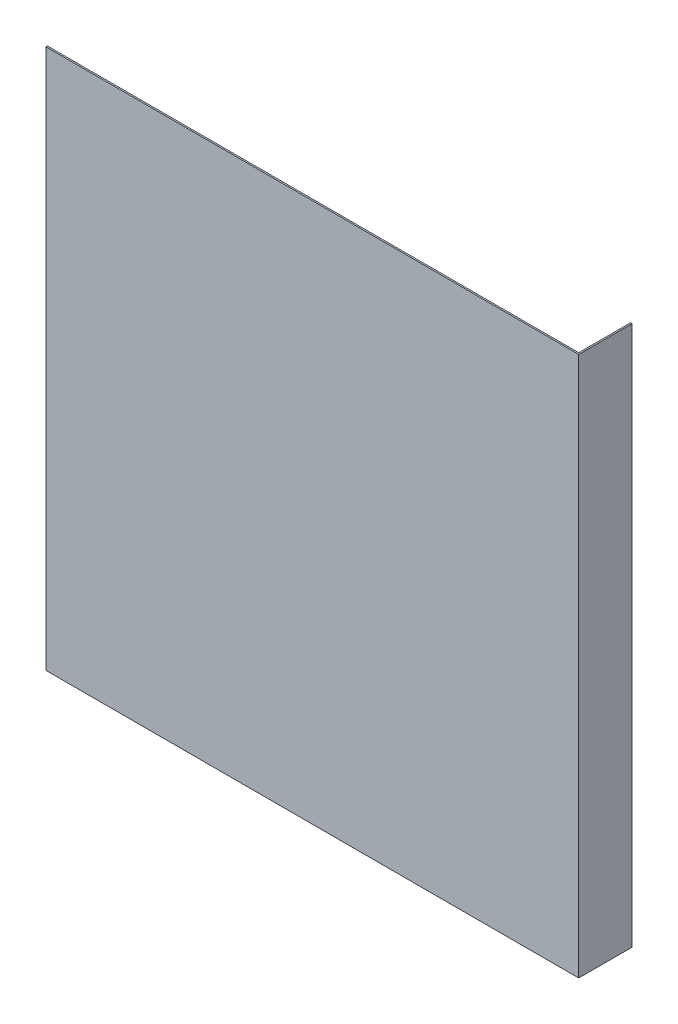
ISO-10303-21;
HEADER;
FILE_DESCRIPTION(('STEP AP214'),'2;1');
FILE_NAME('part.step','',(''),(''),'','','');
FILE_SCHEMA(('AUTOMOTIVE_DESIGN { 1 0 10303 214 1 1 1 1 }'));
ENDSEC;
DATA;
#1=APPLICATION_CONTEXT('core data for automotive mechanical design processes');
#2=APPLICATION_PROTOCOL_DEFINITION('international standard','automotive_design',2000,#1);
#3=PRODUCT_CONTEXT('',#1,'mechanical');
#4=PRODUCT('Part','Part','',(#3));
#5=PRODUCT_RELATED_PRODUCT_CATEGORY('part','',(#4));
#6=PRODUCT_DEFINITION_FORMATION('','',#4);
#7=PRODUCT_DEFINITION_CONTEXT('part definition',#1,'design');
#8=PRODUCT_DEFINITION('design','',#6,#7);
#9=PRODUCT_DEFINITION_SHAPE('','',#8);
#10=(LENGTH_UNIT() NAMED_UNIT(*) SI_UNIT(.MILLI.,.METRE.));
#11=(NAMED_UNIT(*) PLANE_ANGLE_UNIT() SI_UNIT($,.RADIAN.));
#12=(NAMED_UNIT(*) SI_UNIT($,.STERADIAN.) SOLID_ANGLE_UNIT());
#13=UNCERTAINTY_MEASURE_WITH_UNIT(LENGTH_MEASURE(1.E-05),#10,'distance_accuracy_value','');
#14=(GEOMETRIC_REPRESENTATION_CONTEXT(3) GLOBAL_UNCERTAINTY_ASSIGNED_CONTEXT((#13)) GLOBAL_UNIT_ASSIGNED_CONTEXT((#10,
#11,#12)) REPRESENTATION_CONTEXT('',''));
#15=CARTESIAN_POINT('',(0.,0.,0.));
#16=DIRECTION('',(0.,0.,1.));
#17=DIRECTION('',(1.,0.,0.));
#18=AXIS2_PLACEMENT_3D('',#15,#16,#17);
#19=CARTESIAN_POINT('',(1025.87,72.5,-252.2));
#20=DIRECTION('',(1.,0.,0.));
#21=DIRECTION('',(0.,1.,0.));
#22=AXIS2_PLACEMENT_3D('',#19,#20,#21);
#23=PLANE('',#22);
#24=DIRECTION('',(0.,0.,-1.));
#25=VECTOR('',#24,1.);
#26=CARTESIAN_POINT('',(1025.87,437.5,-252.2));
#27=LINE('',#26,#25);
#28=CARTESIAN_POINT('',(1025.87,437.5,-252.2));
#29=VERTEX_POINT('',#28);
#30=CARTESIAN_POINT('',(1025.87,437.5,-288.2));
#31=VERTEX_POINT('',#30);
#32=EDGE_CURVE('E109',#29,#31,#27,.T.);
#33=ORIENTED_EDGE('',*,*,#32,.F.);
#34=DIRECTION('',(0.,1.,0.));
#35=VECTOR('',#34,1.);
#36=CARTESIAN_POINT('',(1025.87,72.5,-252.2));
#37=LINE('',#36,#35);
#38=CARTESIAN_POINT('',(1025.87,72.5,-252.2));
#39=VERTEX_POINT('',#38);
#40=EDGE_CURVE('E33',#39,#29,#37,.T.);
#41=ORIENTED_EDGE('',*,*,#40,.F.);
#42=DIRECTION('',(0.,0.,-1.));
#43=VECTOR('',#42,1.);
#44=CARTESIAN_POINT('',(1025.87,72.5,-252.2));
#45=LINE('',#44,#43);
#46=CARTESIAN_POINT('',(1025.87,72.5,-288.2));
#47=VERTEX_POINT('',#46);
#48=EDGE_CURVE('E101',#39,#47,#45,.T.);
#49=ORIENTED_EDGE('',*,*,#48,.T.);
#50=DIRECTION('',(0.,1.,0.));
#51=VECTOR('',#50,1.);
#52=CARTESIAN_POINT('',(1025.87,72.5,-288.2));
#53=LINE('',#52,#51);
#54=EDGE_CURVE('E11',#47,#31,#53,.T.);
#55=ORIENTED_EDGE('',*,*,#54,.T.);
#56=EDGE_LOOP('',(#33,#41,#49,#55));
#57=FACE_BOUND('',#56,.T.);
#58=ADVANCED_FACE('F17',(#57),#23,.T.);
#59=CARTESIAN_POINT('',(1025.87,72.5,-288.2));
#60=DIRECTION('',(0.,0.,-1.));
#61=DIRECTION('',(-1.,0.,0.));
#62=AXIS2_PLACEMENT_3D('',#59,#60,#61);
#63=PLANE('',#62);
#64=DIRECTION('',(-1.,0.,0.));
#65=VECTOR('',#64,1.);
#66=CARTESIAN_POINT('',(1025.87,437.5,-288.2));
#67=LINE('',#66,#65);
#68=CARTESIAN_POINT('',(1024.87,437.5,-288.2));
#69=VERTEX_POINT('',#68);
#70=EDGE_CURVE('E105',#31,#69,#67,.T.);
#71=ORIENTED_EDGE('',*,*,#70,.F.);
#72=ORIENTED_EDGE('',*,*,#54,.F.);
#73=DIRECTION('',(-1.,0.,0.));
#74=VECTOR('',#73,1.);
#75=CARTESIAN_POINT('',(1025.87,72.5,-288.2));
#76=LINE('',#75,#74);
#77=CARTESIAN_POINT('',(1024.87,72.5,-288.2));
#78=VERTEX_POINT('',#77);
#79=EDGE_CURVE('E103',#47,#78,#76,.T.);
#80=ORIENTED_EDGE('',*,*,#79,.T.);
#81=DIRECTION('',(0.,1.,0.));
#82=VECTOR('',#81,1.);
#83=CARTESIAN_POINT('',(1024.87,72.5,-288.2));
#84=LINE('',#83,#82);
#85=EDGE_CURVE('E25',#78,#69,#84,.T.);
#86=ORIENTED_EDGE('',*,*,#85,.T.);
#87=EDGE_LOOP('',(#71,#72,#80,#86));
#88=FACE_BOUND('',#87,.T.);
#89=ADVANCED_FACE('F121',(#88),#63,.T.);
#90=CARTESIAN_POINT('',(1024.87,72.5,-288.2));
#91=DIRECTION('',(-1.,0.,0.));
#92=DIRECTION('',(0.,-1.,0.));
#93=AXIS2_PLACEMENT_3D('',#90,#91,#92);
#94=PLANE('',#93);
#95=DIRECTION('',(0.,0.,1.));
#96=VECTOR('',#95,1.);
#97=CARTESIAN_POINT('',(1024.87,437.5,-288.2));
#98=LINE('',#97,#96);
#99=CARTESIAN_POINT('',(1024.87,437.5,-253.2));
#100=VERTEX_POINT('',#99);
#101=EDGE_CURVE('E108',#69,#100,#98,.T.);
#102=ORIENTED_EDGE('',*,*,#101,.F.);
#103=ORIENTED_EDGE('',*,*,#85,.F.);
#104=DIRECTION('',(0.,0.,1.));
#105=VECTOR('',#104,1.);
#106=CARTESIAN_POINT('',(1024.87,72.5,-288.2));
#107=LINE('',#106,#105);
#108=CARTESIAN_POINT('',(1024.87,72.5,-253.2));
#109=VERTEX_POINT('',#108);
#110=EDGE_CURVE('E92',#78,#109,#107,.T.);
#111=ORIENTED_EDGE('',*,*,#110,.T.);
#112=DIRECTION('',(0.,1.,0.));
#113=VECTOR('',#112,1.);
#114=CARTESIAN_POINT('',(1024.87,72.5,-253.2));
#115=LINE('',#114,#113);
#116=EDGE_CURVE('E84',#109,#100,#115,.T.);
#117=ORIENTED_EDGE('',*,*,#116,.T.);
#118=EDGE_LOOP('',(#102,#103,#111,#117));
#119=FACE_BOUND('',#118,.T.);
#120=ADVANCED_FACE('F123',(#119),#94,.T.);
#121=CARTESIAN_POINT('',(1024.87,72.5,-253.2));
#122=DIRECTION('',(0.,0.,-1.));
#123=DIRECTION('',(-1.,0.,0.));
#124=AXIS2_PLACEMENT_3D('',#121,#122,#123);
#125=PLANE('',#124);
#126=DIRECTION('',(-1.,0.,0.));
#127=VECTOR('',#126,1.);
#128=CARTESIAN_POINT('',(1024.87,437.5,-253.2));
#129=LINE('',#128,#127);
#130=CARTESIAN_POINT('',(665.87,437.5,-253.2));
#131=VERTEX_POINT('',#130);
#132=EDGE_CURVE('E112',#100,#131,#129,.T.);
#133=ORIENTED_EDGE('',*,*,#132,.F.);
#134=ORIENTED_EDGE('',*,*,#116,.F.);
#135=DIRECTION('',(-1.,0.,0.));
#136=VECTOR('',#135,1.);
#137=CARTESIAN_POINT('',(1024.87,72.5,-253.2));
#138=LINE('',#137,#136);
#139=CARTESIAN_POINT('',(665.87,72.5,-253.2));
#140=VERTEX_POINT('',#139);
#141=EDGE_CURVE('E87',#109,#140,#138,.T.);
#142=ORIENTED_EDGE('',*,*,#141,.T.);
#143=DIRECTION('',(0.,1.,0.));
#144=VECTOR('',#143,1.);
#145=CARTESIAN_POINT('',(665.87,72.5,-253.2));
#146=LINE('',#145,#144);
#147=EDGE_CURVE('E73',#140,#131,#146,.T.);
#148=ORIENTED_EDGE('',*,*,#147,.T.);
#149=EDGE_LOOP('',(#133,#134,#142,#148));
#150=FACE_BOUND('',#149,.T.);
#151=ADVANCED_FACE('F88',(#150),#125,.T.);
#152=CARTESIAN_POINT('',(665.87,72.5,-253.2));
#153=DIRECTION('',(-1.,0.,0.));
#154=DIRECTION('',(0.,-1.,0.));
#155=AXIS2_PLACEMENT_3D('',#152,#153,#154);
#156=PLANE('',#155);
#157=DIRECTION('',(0.,0.,1.));
#158=VECTOR('',#157,1.);
#159=CARTESIAN_POINT('',(665.87,437.5,-253.2));
#160=LINE('',#159,#158);
#161=CARTESIAN_POINT('',(665.87,437.5,-252.2));
#162=VERTEX_POINT('',#161);
#163=EDGE_CURVE('E80',#131,#162,#160,.T.);
#164=ORIENTED_EDGE('',*,*,#163,.F.);
#165=ORIENTED_EDGE('',*,*,#147,.F.);
#166=DIRECTION('',(0.,0.,1.));
#167=VECTOR('',#166,1.);
#168=CARTESIAN_POINT('',(665.87,72.5,-253.2));
#169=LINE('',#168,#167);
#170=CARTESIAN_POINT('',(665.87,72.5,-252.2));
#171=VERTEX_POINT('',#170);
#172=EDGE_CURVE('E77',#140,#171,#169,.T.);
#173=ORIENTED_EDGE('',*,*,#172,.T.);
#174=DIRECTION('',(0.,1.,0.));
#175=VECTOR('',#174,1.);
#176=CARTESIAN_POINT('',(665.87,72.5,-252.2));
#177=LINE('',#176,#175);
#178=EDGE_CURVE('E55',#171,#162,#177,.T.);
#179=ORIENTED_EDGE('',*,*,#178,.T.);
#180=EDGE_LOOP('',(#164,#165,#173,#179));
#181=FACE_BOUND('',#180,.T.);
#182=ADVANCED_FACE('F75',(#181),#156,.T.);
#183=CARTESIAN_POINT('',(665.87,72.5,-252.2));
#184=DIRECTION('',(0.,0.,1.));
#185=DIRECTION('',(1.,0.,0.));
#186=AXIS2_PLACEMENT_3D('',#183,#184,#185);
#187=PLANE('',#186);
#188=DIRECTION('',(1.,0.,0.));
#189=VECTOR('',#188,1.);
#190=CARTESIAN_POINT('',(665.87,437.5,-252.2));
#191=LINE('',#190,#189);
#192=EDGE_CURVE('E104',#162,#29,#191,.T.);
#193=ORIENTED_EDGE('',*,*,#192,.F.);
#194=ORIENTED_EDGE('',*,*,#178,.F.);
#195=DIRECTION('',(1.,0.,0.));
#196=VECTOR('',#195,1.);
#197=CARTESIAN_POINT('',(665.87,72.5,-252.2));
#198=LINE('',#197,#196);
#199=EDGE_CURVE('E96',#171,#39,#198,.T.);
#200=ORIENTED_EDGE('',*,*,#199,.T.);
#201=ORIENTED_EDGE('',*,*,#40,.T.);
#202=EDGE_LOOP('',(#193,#194,#200,#201));
#203=FACE_BOUND('',#202,.T.);
#204=ADVANCED_FACE('F141',(#203),#187,.T.);
#205=CARTESIAN_POINT('',(1025.87,72.5,-288.2));
#206=DIRECTION('',(0.,1.,0.));
#207=DIRECTION('',(0.,0.,1.));
#208=AXIS2_PLACEMENT_3D('',#205,#206,#207);
#209=PLANE('',#208);
#210=ORIENTED_EDGE('',*,*,#48,.F.);
#211=ORIENTED_EDGE('',*,*,#199,.F.);
#212=ORIENTED_EDGE('',*,*,#172,.F.);
#213=ORIENTED_EDGE('',*,*,#141,.F.);
#214=ORIENTED_EDGE('',*,*,#110,.F.);
#215=ORIENTED_EDGE('',*,*,#79,.F.);
#216=EDGE_LOOP('',(#210,#211,#212,#213,#214,#215));
#217=FACE_BOUND('',#216,.T.);
#218=ADVANCED_FACE('F95',(#217),#209,.F.);
#219=CARTESIAN_POINT('',(1025.87,437.5,-288.2));
#220=DIRECTION('',(0.,1.,0.));
#221=DIRECTION('',(0.,0.,1.));
#222=AXIS2_PLACEMENT_3D('',#219,#220,#221);
#223=PLANE('',#222);
#224=ORIENTED_EDGE('',*,*,#32,.T.);
#225=ORIENTED_EDGE('',*,*,#70,.T.);
#226=ORIENTED_EDGE('',*,*,#101,.T.);
#227=ORIENTED_EDGE('',*,*,#132,.T.);
#228=ORIENTED_EDGE('',*,*,#163,.T.);
#229=ORIENTED_EDGE('',*,*,#192,.T.);
#230=EDGE_LOOP('',(#224,#225,#226,#227,#228,#229));
#231=FACE_BOUND('',#230,.T.);
#232=ADVANCED_FACE('F125',(#231),#223,.T.);
#233=CLOSED_SHELL('',(#58,#89,#120,#151,#182,#204,#218,#232));
#234=MANIFOLD_SOLID_BREP('B1',#233);
#235=ADVANCED_BREP_SHAPE_REPRESENTATION('',(#18,#234),#14);
#236=SHAPE_DEFINITION_REPRESENTATION(#9,#235);
ENDSEC;
END-ISO-10303-21;
